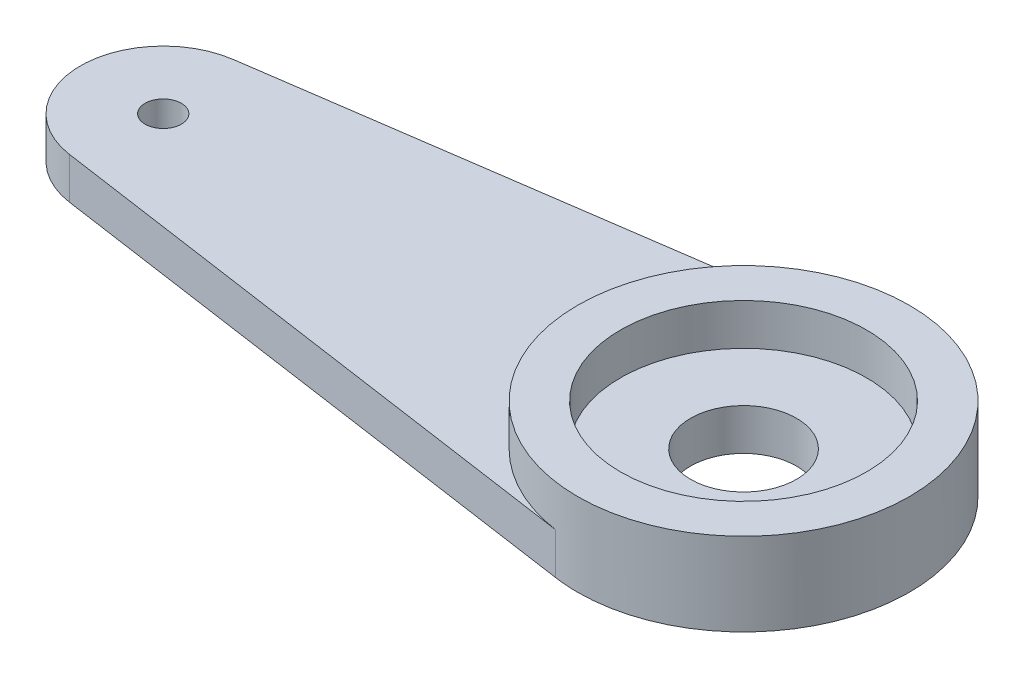
ISO-10303-21;
HEADER;
FILE_DESCRIPTION(('STEP AP214'),'2;1');
FILE_NAME('part.step','',(''),(''),'','','');
FILE_SCHEMA(('AUTOMOTIVE_DESIGN { 1 0 10303 214 1 1 1 1 }'));
ENDSEC;
DATA;
#1=APPLICATION_CONTEXT('core data for automotive mechanical design processes');
#2=APPLICATION_PROTOCOL_DEFINITION('international standard','automotive_design',2000,#1);
#3=PRODUCT_CONTEXT('',#1,'mechanical');
#4=PRODUCT('Part','Part','',(#3));
#5=PRODUCT_RELATED_PRODUCT_CATEGORY('part','',(#4));
#6=PRODUCT_DEFINITION_FORMATION('','',#4);
#7=PRODUCT_DEFINITION_CONTEXT('part definition',#1,'design');
#8=PRODUCT_DEFINITION('design','',#6,#7);
#9=PRODUCT_DEFINITION_SHAPE('','',#8);
#10=(LENGTH_UNIT() NAMED_UNIT(*) SI_UNIT(.MILLI.,.METRE.));
#11=(NAMED_UNIT(*) PLANE_ANGLE_UNIT() SI_UNIT($,.RADIAN.));
#12=(NAMED_UNIT(*) SI_UNIT($,.STERADIAN.) SOLID_ANGLE_UNIT());
#13=UNCERTAINTY_MEASURE_WITH_UNIT(LENGTH_MEASURE(1.E-05),#10,'distance_accuracy_value','');
#14=(GEOMETRIC_REPRESENTATION_CONTEXT(3) GLOBAL_UNCERTAINTY_ASSIGNED_CONTEXT((#13)) GLOBAL_UNIT_ASSIGNED_CONTEXT((#10,
#11,#12)) REPRESENTATION_CONTEXT('',''));
#15=CARTESIAN_POINT('',(0.,0.,0.));
#16=DIRECTION('',(0.,0.,1.));
#17=DIRECTION('',(1.,0.,0.));
#18=AXIS2_PLACEMENT_3D('',#15,#16,#17);
#19=CARTESIAN_POINT('',(0.,-6.35,0.));
#20=DIRECTION('',(0.,1.,0.));
#21=DIRECTION('',(0.,0.,1.));
#22=AXIS2_PLACEMENT_3D('',#19,#20,#21);
#23=CYLINDRICAL_SURFACE('',#22,12.7);
#24=CARTESIAN_POINT('',(0.,0.,0.));
#25=DIRECTION('',(0.,1.,0.));
#26=DIRECTION('',(0.,0.,1.));
#27=AXIS2_PLACEMENT_3D('',#24,#25,#26);
#28=CIRCLE('',#27,12.7);
#29=CARTESIAN_POINT('',(-1.81428571428571,0.,-12.569740146357));
#30=VERTEX_POINT('',#29);
#31=CARTESIAN_POINT('',(-1.81428571428571,0.,12.569740146357));
#32=VERTEX_POINT('',#31);
#33=EDGE_CURVE('E98',#30,#32,#28,.T.);
#34=ORIENTED_EDGE('',*,*,#33,.F.);
#35=DIRECTION('',(0.,1.,0.));
#36=VECTOR('',#35,1.);
#37=CARTESIAN_POINT('',(-1.81428571428571,-6.35,-12.569740146357));
#38=LINE('',#37,#36);
#39=CARTESIAN_POINT('',(-1.81428571428571,-6.35,-12.569740146357));
#40=VERTEX_POINT('',#39);
#41=EDGE_CURVE('E11',#40,#30,#38,.T.);
#42=ORIENTED_EDGE('',*,*,#41,.F.);
#43=CARTESIAN_POINT('',(0.,-6.35,0.));
#44=DIRECTION('',(0.,1.,0.));
#45=DIRECTION('',(0.,0.,1.));
#46=AXIS2_PLACEMENT_3D('',#43,#44,#45);
#47=CIRCLE('',#46,12.7);
#48=CARTESIAN_POINT('',(-1.81428571428571,-6.35,12.569740146357));
#49=VERTEX_POINT('',#48);
#50=EDGE_CURVE('E81',#40,#49,#47,.T.);
#51=ORIENTED_EDGE('',*,*,#50,.T.);
#52=DIRECTION('',(0.,1.,0.));
#53=VECTOR('',#52,1.);
#54=CARTESIAN_POINT('',(-1.81428571428571,-6.35,12.569740146357));
#55=LINE('',#54,#53);
#56=EDGE_CURVE('E70',#49,#32,#55,.T.);
#57=ORIENTED_EDGE('',*,*,#56,.T.);
#58=EDGE_LOOP('',(#34,#42,#51,#57));
#59=FACE_BOUND('',#58,.T.);
#60=ADVANCED_FACE('F30',(#59),#23,.T.);
#61=CARTESIAN_POINT('',(-1.81428571428571,-6.35,-12.569740146357));
#62=DIRECTION('',(-0.142857142857143,0.,-0.989743318610787));
#63=DIRECTION('',(-0.989743318610787,0.,0.142857142857143));
#64=AXIS2_PLACEMENT_3D('',#61,#62,#63);
#65=PLANE('',#64);
#66=DIRECTION('',(-0.989743318610787,0.,0.142857142857143));
#67=VECTOR('',#66,1.);
#68=CARTESIAN_POINT('',(-1.81428571428571,0.,-12.569740146357));
#69=LINE('',#68,#67);
#70=CARTESIAN_POINT('',(85.2714285714286,0.,-25.139480292714));
#71=VERTEX_POINT('',#70);
#72=EDGE_CURVE('E74',#71,#30,#69,.T.);
#73=ORIENTED_EDGE('',*,*,#72,.F.);
#74=DIRECTION('',(0.,1.,0.));
#75=VECTOR('',#74,1.);
#76=CARTESIAN_POINT('',(85.2714285714286,-6.35,-25.139480292714));
#77=LINE('',#76,#75);
#78=CARTESIAN_POINT('',(85.2714285714286,-6.35,-25.139480292714));
#79=VERTEX_POINT('',#78);
#80=EDGE_CURVE('E39',#79,#71,#77,.T.);
#81=ORIENTED_EDGE('',*,*,#80,.F.);
#82=DIRECTION('',(-0.989743318610787,0.,0.142857142857143));
#83=VECTOR('',#82,1.);
#84=CARTESIAN_POINT('',(-1.81428571428571,-6.35,-12.569740146357));
#85=LINE('',#84,#83);
#86=EDGE_CURVE('E117',#79,#40,#85,.T.);
#87=ORIENTED_EDGE('',*,*,#86,.T.);
#88=ORIENTED_EDGE('',*,*,#41,.T.);
#89=EDGE_LOOP('',(#73,#81,#87,#88));
#90=FACE_BOUND('',#89,.T.);
#91=ADVANCED_FACE('F76',(#90),#65,.T.);
#92=CARTESIAN_POINT('',(88.9,-6.35,0.));
#93=DIRECTION('',(0.,1.,0.));
#94=DIRECTION('',(0.,0.,1.));
#95=AXIS2_PLACEMENT_3D('',#92,#93,#94);
#96=CYLINDRICAL_SURFACE('',#95,25.4);
#97=ORIENTED_EDGE('',*,*,#80,.T.);
#98=CARTESIAN_POINT('',(88.9,0.,0.));
#99=DIRECTION('',(0.,1.,0.));
#100=DIRECTION('',(0.,0.,1.));
#101=AXIS2_PLACEMENT_3D('',#98,#99,#100);
#102=CIRCLE('',#101,25.4);
#103=CARTESIAN_POINT('',(85.2714285714286,0.,25.139480292714));
#104=VERTEX_POINT('',#103);
#105=EDGE_CURVE('E88',#71,#104,#102,.T.);
#106=ORIENTED_EDGE('',*,*,#105,.T.);
#107=DIRECTION('',(0.,1.,0.));
#108=VECTOR('',#107,1.);
#109=CARTESIAN_POINT('',(85.2714285714286,-6.35,25.139480292714));
#110=LINE('',#109,#108);
#111=CARTESIAN_POINT('',(85.2714285714286,-6.35,25.139480292714));
#112=VERTEX_POINT('',#111);
#113=EDGE_CURVE('E62',#112,#104,#110,.T.);
#114=ORIENTED_EDGE('',*,*,#113,.F.);
#115=CARTESIAN_POINT('',(88.9,-6.35,0.));
#116=DIRECTION('',(0.,1.,0.));
#117=DIRECTION('',(0.,0.,1.));
#118=AXIS2_PLACEMENT_3D('',#115,#116,#117);
#119=CIRCLE('',#118,25.4);
#120=EDGE_CURVE('E90',#112,#79,#119,.T.);
#121=ORIENTED_EDGE('',*,*,#120,.T.);
#122=EDGE_LOOP('',(#97,#106,#114,#121));
#123=FACE_BOUND('',#122,.T.);
#124=CARTESIAN_POINT('',(88.9,6.35,0.));
#125=DIRECTION('',(0.,1.,0.));
#126=DIRECTION('',(0.,0.,1.));
#127=AXIS2_PLACEMENT_3D('',#124,#125,#126);
#128=CIRCLE('',#127,25.4);
#129=CARTESIAN_POINT('',(88.9,6.35,25.4));
#130=VERTEX_POINT('',#129);
#131=EDGE_CURVE('E94',#130,#130,#128,.T.);
#132=ORIENTED_EDGE('',*,*,#131,.F.);
#133=EDGE_LOOP('',(#132));
#134=FACE_BOUND('',#133,.T.);
#135=ADVANCED_FACE('F86',(#123,#134),#96,.T.);
#136=CARTESIAN_POINT('',(-1.81428571428571,-6.35,12.569740146357));
#137=DIRECTION('',(-0.142857142857143,0.,0.989743318610787));
#138=DIRECTION('',(0.989743318610787,0.,0.142857142857143));
#139=AXIS2_PLACEMENT_3D('',#136,#137,#138);
#140=PLANE('',#139);
#141=DIRECTION('',(0.989743318610787,0.,0.142857142857143));
#142=VECTOR('',#141,1.);
#143=CARTESIAN_POINT('',(-1.81428571428571,0.,12.569740146357));
#144=LINE('',#143,#142);
#145=EDGE_CURVE('E82',#32,#104,#144,.T.);
#146=ORIENTED_EDGE('',*,*,#145,.F.);
#147=ORIENTED_EDGE('',*,*,#56,.F.);
#148=DIRECTION('',(0.989743318610787,0.,0.142857142857143));
#149=VECTOR('',#148,1.);
#150=CARTESIAN_POINT('',(-1.81428571428571,-6.35,12.569740146357));
#151=LINE('',#150,#149);
#152=EDGE_CURVE('E119',#49,#112,#151,.T.);
#153=ORIENTED_EDGE('',*,*,#152,.T.);
#154=ORIENTED_EDGE('',*,*,#113,.T.);
#155=EDGE_LOOP('',(#146,#147,#153,#154));
#156=FACE_BOUND('',#155,.T.);
#157=ADVANCED_FACE('F123',(#156),#140,.T.);
#158=CARTESIAN_POINT('',(0.,-6.35,0.));
#159=DIRECTION('',(0.,1.,0.));
#160=DIRECTION('',(0.,0.,1.));
#161=AXIS2_PLACEMENT_3D('',#158,#159,#160);
#162=PLANE('',#161);
#163=CARTESIAN_POINT('',(88.9,-6.35,0.));
#164=DIRECTION('',(0.,1.,0.));
#165=DIRECTION('',(0.,0.,1.));
#166=AXIS2_PLACEMENT_3D('',#163,#164,#165);
#167=CIRCLE('',#166,8.11350211568639);
#168=CARTESIAN_POINT('',(88.9,-6.35,8.11350211568639));
#169=VERTEX_POINT('',#168);
#170=EDGE_CURVE('E219',#169,#169,#167,.T.);
#171=ORIENTED_EDGE('',*,*,#170,.T.);
#172=EDGE_LOOP('',(#171));
#173=FACE_BOUND('',#172,.T.);
#174=CARTESIAN_POINT('',(0.,-6.35,0.));
#175=DIRECTION('',(0.,1.,0.));
#176=DIRECTION('',(0.,0.,1.));
#177=AXIS2_PLACEMENT_3D('',#174,#175,#176);
#178=CIRCLE('',#177,2.77812499999999);
#179=CARTESIAN_POINT('',(0.,-6.35,2.77812499999999));
#180=VERTEX_POINT('',#179);
#181=EDGE_CURVE('E95',#180,#180,#178,.T.);
#182=ORIENTED_EDGE('',*,*,#181,.T.);
#183=EDGE_LOOP('',(#182));
#184=FACE_BOUND('',#183,.T.);
#185=ORIENTED_EDGE('',*,*,#50,.F.);
#186=ORIENTED_EDGE('',*,*,#86,.F.);
#187=ORIENTED_EDGE('',*,*,#120,.F.);
#188=ORIENTED_EDGE('',*,*,#152,.F.);
#189=EDGE_LOOP('',(#185,#186,#187,#188));
#190=FACE_BOUND('',#189,.T.);
#191=ADVANCED_FACE('F121',(#173,#184,#190),#162,.F.);
#192=CARTESIAN_POINT('',(0.,0.,0.));
#193=DIRECTION('',(0.,1.,0.));
#194=DIRECTION('',(0.,0.,1.));
#195=AXIS2_PLACEMENT_3D('',#192,#193,#194);
#196=PLANE('',#195);
#197=CARTESIAN_POINT('',(0.,0.,0.));
#198=DIRECTION('',(0.,1.,0.));
#199=DIRECTION('',(0.,0.,1.));
#200=AXIS2_PLACEMENT_3D('',#197,#198,#199);
#201=CIRCLE('',#200,2.77812499999999);
#202=CARTESIAN_POINT('',(0.,0.,2.778125));
#203=VERTEX_POINT('',#202);
#204=EDGE_CURVE('E101',#203,#203,#201,.T.);
#205=ORIENTED_EDGE('',*,*,#204,.F.);
#206=EDGE_LOOP('',(#205));
#207=FACE_BOUND('',#206,.T.);
#208=ORIENTED_EDGE('',*,*,#105,.F.);
#209=ORIENTED_EDGE('',*,*,#72,.T.);
#210=ORIENTED_EDGE('',*,*,#33,.T.);
#211=ORIENTED_EDGE('',*,*,#145,.T.);
#212=EDGE_LOOP('',(#208,#209,#210,#211));
#213=FACE_BOUND('',#212,.T.);
#214=ADVANCED_FACE('F93',(#207,#213),#196,.T.);
#215=CARTESIAN_POINT('',(88.9,6.35,0.));
#216=DIRECTION('',(0.,1.,0.));
#217=DIRECTION('',(0.,0.,1.));
#218=AXIS2_PLACEMENT_3D('',#215,#216,#217);
#219=PLANE('',#218);
#220=CARTESIAN_POINT('',(88.9,6.35,0.));
#221=DIRECTION('',(0.,1.,0.));
#222=DIRECTION('',(0.,0.,1.));
#223=AXIS2_PLACEMENT_3D('',#220,#221,#222);
#224=CIRCLE('',#223,18.8486779459563);
#225=CARTESIAN_POINT('',(88.9,6.35,18.8486779459563));
#226=VERTEX_POINT('',#225);
#227=EDGE_CURVE('E220',#226,#226,#224,.T.);
#228=ORIENTED_EDGE('',*,*,#227,.F.);
#229=EDGE_LOOP('',(#228));
#230=FACE_BOUND('',#229,.T.);
#231=ORIENTED_EDGE('',*,*,#131,.T.);
#232=EDGE_LOOP('',(#231));
#233=FACE_BOUND('',#232,.T.);
#234=ADVANCED_FACE('F130',(#230,#233),#219,.T.);
#235=CARTESIAN_POINT('',(0.,0.,0.));
#236=DIRECTION('',(0.,1.,0.));
#237=DIRECTION('',(0.,0.,1.));
#238=AXIS2_PLACEMENT_3D('',#235,#236,#237);
#239=CYLINDRICAL_SURFACE('',#238,2.77812499999999);
#240=ORIENTED_EDGE('',*,*,#204,.T.);
#241=EDGE_LOOP('',(#240));
#242=FACE_BOUND('',#241,.T.);
#243=ORIENTED_EDGE('',*,*,#181,.F.);
#244=EDGE_LOOP('',(#243));
#245=FACE_BOUND('',#244,.T.);
#246=ADVANCED_FACE('F165',(#242,#245),#239,.F.);
#247=CARTESIAN_POINT('',(88.9,0.,0.));
#248=DIRECTION('',(0.,1.,0.));
#249=DIRECTION('',(0.,0.,1.));
#250=AXIS2_PLACEMENT_3D('',#247,#248,#249);
#251=CYLINDRICAL_SURFACE('',#250,18.8486779459563);
#252=CARTESIAN_POINT('',(88.9,0.,0.));
#253=DIRECTION('',(0.,1.,0.));
#254=DIRECTION('',(0.,0.,1.));
#255=AXIS2_PLACEMENT_3D('',#252,#253,#254);
#256=CIRCLE('',#255,18.8486779459563);
#257=CARTESIAN_POINT('',(88.9,0.,18.8486779459563));
#258=VERTEX_POINT('',#257);
#259=EDGE_CURVE('E223',#258,#258,#256,.T.);
#260=ORIENTED_EDGE('',*,*,#259,.F.);
#261=EDGE_LOOP('',(#260));
#262=FACE_BOUND('',#261,.T.);
#263=ORIENTED_EDGE('',*,*,#227,.T.);
#264=EDGE_LOOP('',(#263));
#265=FACE_BOUND('',#264,.T.);
#266=ADVANCED_FACE('F170',(#262,#265),#251,.F.);
#267=CARTESIAN_POINT('',(88.9,0.,0.));
#268=DIRECTION('',(0.,1.,0.));
#269=DIRECTION('',(0.,0.,1.));
#270=AXIS2_PLACEMENT_3D('',#267,#268,#269);
#271=PLANE('',#270);
#272=CARTESIAN_POINT('',(88.9,0.,0.));
#273=DIRECTION('',(0.,1.,0.));
#274=DIRECTION('',(0.,0.,1.));
#275=AXIS2_PLACEMENT_3D('',#272,#273,#274);
#276=CIRCLE('',#275,8.11350211568639);
#277=CARTESIAN_POINT('',(88.9,0.,8.11350211568639));
#278=VERTEX_POINT('',#277);
#279=EDGE_CURVE('E217',#278,#278,#276,.T.);
#280=ORIENTED_EDGE('',*,*,#279,.F.);
#281=EDGE_LOOP('',(#280));
#282=FACE_BOUND('',#281,.T.);
#283=ORIENTED_EDGE('',*,*,#259,.T.);
#284=EDGE_LOOP('',(#283));
#285=FACE_BOUND('',#284,.T.);
#286=ADVANCED_FACE('F186',(#282,#285),#271,.T.);
#287=CARTESIAN_POINT('',(88.9,-6.350025,0.));
#288=DIRECTION('',(0.,1.,0.));
#289=DIRECTION('',(0.,0.,1.));
#290=AXIS2_PLACEMENT_3D('',#287,#288,#289);
#291=CYLINDRICAL_SURFACE('',#290,8.11350211568639);
#292=CARTESIAN_POINT('',(88.9,0.,8.11350211568639));
#293=CARTESIAN_POINT('',(88.9,-0.0661458333333333,8.11350211568639));
#294=CARTESIAN_POINT('',(88.9,-0.132291666666667,8.11350211568639));
#295=CARTESIAN_POINT('',(88.9,-0.264583333333333,8.11350211568639));
#296=CARTESIAN_POINT('',(88.9,-0.330729166666666,8.11350211568639));
#297=CARTESIAN_POINT('',(88.9,-0.463020833333333,8.11350211568639));
#298=CARTESIAN_POINT('',(88.9,-0.529166666666667,8.11350211568639));
#299=CARTESIAN_POINT('',(88.9,-0.661458333333334,8.11350211568639));
#300=CARTESIAN_POINT('',(88.9,-0.727604166666667,8.11350211568639));
#301=CARTESIAN_POINT('',(88.9,-0.859895833333334,8.11350211568639));
#302=CARTESIAN_POINT('',(88.9,-0.926041666666667,8.11350211568639));
#303=CARTESIAN_POINT('',(88.9,-1.05833333333333,8.11350211568639));
#304=CARTESIAN_POINT('',(88.9,-1.12447916666667,8.11350211568639));
#305=CARTESIAN_POINT('',(88.9,-1.25677083333333,8.11350211568639));
#306=CARTESIAN_POINT('',(88.9,-1.32291666666667,8.11350211568639));
#307=CARTESIAN_POINT('',(88.9,-1.45520833333333,8.11350211568639));
#308=CARTESIAN_POINT('',(88.9,-1.52135416666667,8.11350211568639));
#309=CARTESIAN_POINT('',(88.9,-1.65364583333333,8.11350211568639));
#310=CARTESIAN_POINT('',(88.9,-1.71979166666667,8.11350211568639));
#311=CARTESIAN_POINT('',(88.9,-1.85208333333333,8.11350211568639));
#312=CARTESIAN_POINT('',(88.9,-1.91822916666667,8.11350211568639));
#313=CARTESIAN_POINT('',(88.9,-2.05052083333333,8.11350211568639));
#314=CARTESIAN_POINT('',(88.9,-2.11666666666667,8.11350211568639));
#315=CARTESIAN_POINT('',(88.9,-2.24895833333333,8.11350211568639));
#316=CARTESIAN_POINT('',(88.9,-2.31510416666667,8.11350211568639));
#317=CARTESIAN_POINT('',(88.9,-2.44739583333333,8.11350211568639));
#318=CARTESIAN_POINT('',(88.9,-2.51354166666667,8.11350211568639));
#319=CARTESIAN_POINT('',(88.9,-2.64583333333333,8.11350211568639));
#320=CARTESIAN_POINT('',(88.9,-2.71197916666667,8.11350211568639));
#321=CARTESIAN_POINT('',(88.9,-2.84427083333333,8.11350211568639));
#322=CARTESIAN_POINT('',(88.9,-2.91041666666667,8.11350211568639));
#323=CARTESIAN_POINT('',(88.9,-3.04270833333333,8.11350211568639));
#324=CARTESIAN_POINT('',(88.9,-3.10885416666667,8.11350211568639));
#325=CARTESIAN_POINT('',(88.9,-3.24114583333333,8.11350211568639));
#326=CARTESIAN_POINT('',(88.9,-3.30729166666667,8.11350211568639));
#327=CARTESIAN_POINT('',(88.9,-3.43958333333333,8.11350211568639));
#328=CARTESIAN_POINT('',(88.9,-3.50572916666667,8.11350211568639));
#329=CARTESIAN_POINT('',(88.9,-3.63802083333333,8.11350211568639));
#330=CARTESIAN_POINT('',(88.9,-3.70416666666667,8.11350211568639));
#331=CARTESIAN_POINT('',(88.9,-3.83645833333333,8.11350211568639));
#332=CARTESIAN_POINT('',(88.9,-3.90260416666667,8.11350211568639));
#333=CARTESIAN_POINT('',(88.9,-4.03489583333333,8.11350211568639));
#334=CARTESIAN_POINT('',(88.9,-4.10104166666667,8.11350211568639));
#335=CARTESIAN_POINT('',(88.9,-4.23333333333333,8.11350211568639));
#336=CARTESIAN_POINT('',(88.9,-4.29947916666667,8.11350211568639));
#337=CARTESIAN_POINT('',(88.9,-4.43177083333333,8.11350211568639));
#338=CARTESIAN_POINT('',(88.9,-4.49791666666667,8.11350211568639));
#339=CARTESIAN_POINT('',(88.9,-4.63020833333333,8.11350211568639));
#340=CARTESIAN_POINT('',(88.9,-4.69635416666667,8.11350211568639));
#341=CARTESIAN_POINT('',(88.9,-4.82864583333333,8.11350211568639));
#342=CARTESIAN_POINT('',(88.9,-4.89479166666667,8.11350211568639));
#343=CARTESIAN_POINT('',(88.9,-5.02708333333333,8.11350211568639));
#344=CARTESIAN_POINT('',(88.9,-5.09322916666667,8.11350211568639));
#345=CARTESIAN_POINT('',(88.9,-5.22552083333333,8.11350211568639));
#346=CARTESIAN_POINT('',(88.9,-5.29166666666667,8.11350211568639));
#347=CARTESIAN_POINT('',(88.9,-5.42395833333333,8.11350211568639));
#348=CARTESIAN_POINT('',(88.9,-5.49010416666667,8.11350211568639));
#349=CARTESIAN_POINT('',(88.9,-5.62239583333333,8.11350211568639));
#350=CARTESIAN_POINT('',(88.9,-5.68854166666667,8.11350211568639));
#351=CARTESIAN_POINT('',(88.9,-5.82083333333333,8.11350211568639));
#352=CARTESIAN_POINT('',(88.9,-5.88697916666667,8.11350211568639));
#353=CARTESIAN_POINT('',(88.9,-6.01927083333333,8.11350211568639));
#354=CARTESIAN_POINT('',(88.9,-6.08541666666667,8.11350211568639));
#355=CARTESIAN_POINT('',(88.9,-6.21770833333333,8.11350211568639));
#356=CARTESIAN_POINT('',(88.9,-6.28385416666667,8.11350211568639));
#357=CARTESIAN_POINT('',(88.9,-6.35,8.11350211568639));
#358=B_SPLINE_CURVE_WITH_KNOTS('',3,(#292,#293,#294,#295,#296,#297,#298,#299,#300,#301,#302,
#303,#304,#305,#306,#307,#308,#309,#310,#311,#312,#313,#314,#315,#316,#317,#318,#319,#320,#321,
#322,#323,#324,#325,#326,#327,#328,#329,#330,#331,#332,#333,#334,#335,#336,#337,#338,#339,#340,
#341,#342,#343,#344,#345,#346,#347,#348,#349,#350,#351,#352,#353,#354,#355,#356,#357),
.UNSPECIFIED.,.F.,.F.,(4,2,2,2,2,2,2,2,2,2,2,2,2,2,2,2,2,2,2,2,2,2,2,2,2,2,2,2,2,2,2,2,4),(0.,
0.1984375,0.396875,0.5953125,0.79375,0.9921875,1.190625,1.3890625,1.5875,1.7859375,1.984375,
2.1828125,2.38125,2.5796875,2.778125,2.9765625,3.175,3.3734375,3.571875,3.7703125,3.96875,
4.1671875,4.365625,4.5640625,4.7625,4.9609375,5.159375,5.3578125,5.55625,5.7546875,5.953125,
6.1515625,6.35),.UNSPECIFIED.);
#359=EDGE_CURVE('BSEAM200',#278,#169,#358,.T.);
#360=ORIENTED_EDGE('',*,*,#279,.T.);
#361=ORIENTED_EDGE('',*,*,#170,.F.);
#362=ORIENTED_EDGE('',*,*,#359,.T.);
#363=ORIENTED_EDGE('',*,*,#359,.F.);
#364=EDGE_LOOP('',(#360,#362,#361,#363));
#365=FACE_BOUND('',#364,.T.);
#366=ADVANCED_FACE('F200',(#365),#291,.F.);
#367=CLOSED_SHELL('',(#60,#91,#135,#157,#191,#214,#234,#246,#266,#286,#366));
#368=MANIFOLD_SOLID_BREP('B2',#367);
#369=ADVANCED_BREP_SHAPE_REPRESENTATION('',(#18,#368),#14);
#370=SHAPE_DEFINITION_REPRESENTATION(#9,#369);
ENDSEC;
END-ISO-10303-21;
